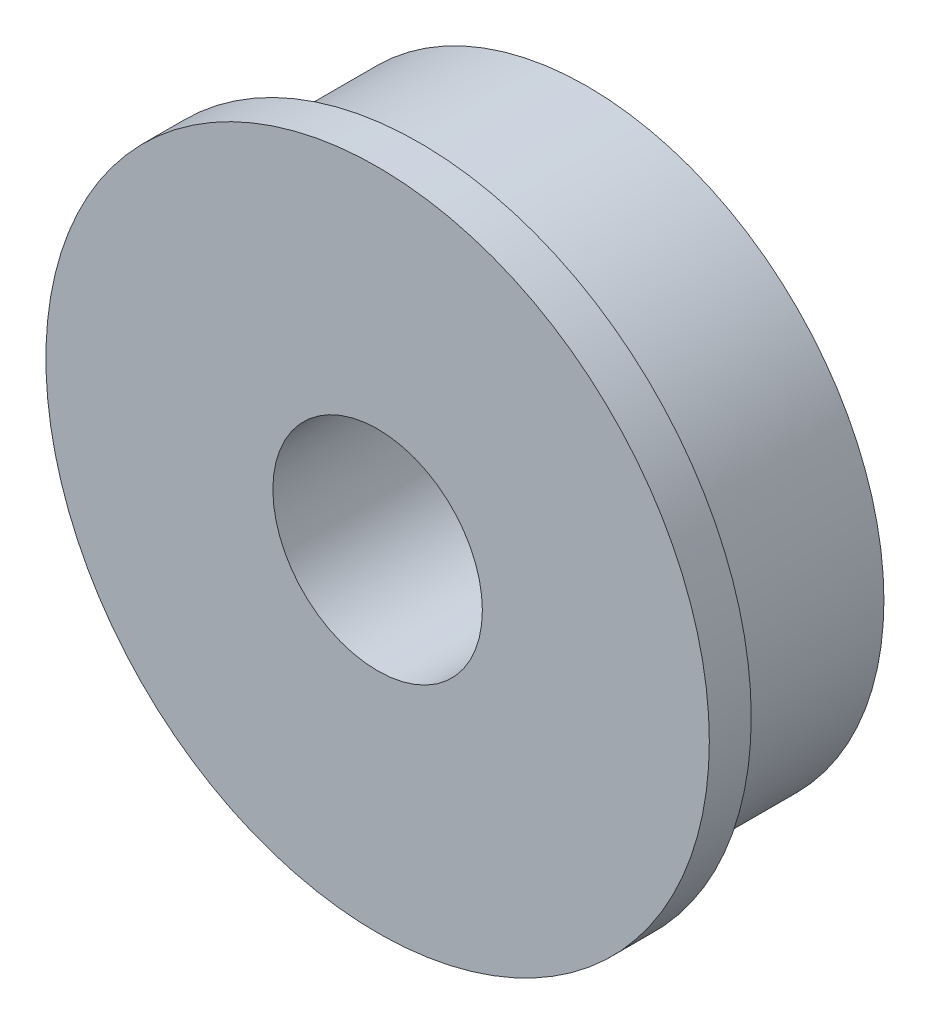
ISO-10303-21;
HEADER;
FILE_DESCRIPTION(('STEP AP214'),'2;1');
FILE_NAME('part.step','',(''),(''),'','','');
FILE_SCHEMA(('AUTOMOTIVE_DESIGN { 1 0 10303 214 1 1 1 1 }'));
ENDSEC;
DATA;
#1=APPLICATION_CONTEXT('core data for automotive mechanical design processes');
#2=APPLICATION_PROTOCOL_DEFINITION('international standard','automotive_design',2000,#1);
#3=PRODUCT_CONTEXT('',#1,'mechanical');
#4=PRODUCT('Part','Part','',(#3));
#5=PRODUCT_RELATED_PRODUCT_CATEGORY('part','',(#4));
#6=PRODUCT_DEFINITION_FORMATION('','',#4);
#7=PRODUCT_DEFINITION_CONTEXT('part definition',#1,'design');
#8=PRODUCT_DEFINITION('design','',#6,#7);
#9=PRODUCT_DEFINITION_SHAPE('','',#8);
#10=(LENGTH_UNIT() NAMED_UNIT(*) SI_UNIT(.MILLI.,.METRE.));
#11=(NAMED_UNIT(*) PLANE_ANGLE_UNIT() SI_UNIT($,.RADIAN.));
#12=(NAMED_UNIT(*) SI_UNIT($,.STERADIAN.) SOLID_ANGLE_UNIT());
#13=UNCERTAINTY_MEASURE_WITH_UNIT(LENGTH_MEASURE(1.E-05),#10,'distance_accuracy_value','');
#14=(GEOMETRIC_REPRESENTATION_CONTEXT(3) GLOBAL_UNCERTAINTY_ASSIGNED_CONTEXT((#13)) GLOBAL_UNIT_ASSIGNED_CONTEXT((#10,
#11,#12)) REPRESENTATION_CONTEXT('',''));
#15=CARTESIAN_POINT('',(0.,0.,0.));
#16=DIRECTION('',(0.,0.,1.));
#17=DIRECTION('',(1.,0.,0.));
#18=AXIS2_PLACEMENT_3D('',#15,#16,#17);
#19=CARTESIAN_POINT('',(0.,0.,6.));
#20=DIRECTION('',(0.,0.,-1.));
#21=DIRECTION('',(-1.,0.,0.));
#22=AXIS2_PLACEMENT_3D('',#19,#20,#21);
#23=CYLINDRICAL_SURFACE('',#22,8.5);
#24=CARTESIAN_POINT('',(0.,0.,0.));
#25=DIRECTION('',(0.,0.,1.));
#26=DIRECTION('',(1.,0.,0.));
#27=AXIS2_PLACEMENT_3D('',#24,#25,#26);
#28=CIRCLE('',#27,8.5);
#29=CARTESIAN_POINT('',(8.5,0.,0.));
#30=VERTEX_POINT('',#29);
#31=EDGE_CURVE('E43',#30,#30,#28,.T.);
#32=ORIENTED_EDGE('',*,*,#31,.T.);
#33=EDGE_LOOP('',(#32));
#34=FACE_BOUND('',#33,.T.);
#35=CARTESIAN_POINT('',(0.,0.,4.8));
#36=DIRECTION('',(0.,0.,1.));
#37=DIRECTION('',(1.,0.,0.));
#38=AXIS2_PLACEMENT_3D('',#35,#36,#37);
#39=CIRCLE('',#38,8.5);
#40=CARTESIAN_POINT('',(8.5,0.,4.8));
#41=VERTEX_POINT('',#40);
#42=EDGE_CURVE('E10',#41,#41,#39,.T.);
#43=ORIENTED_EDGE('',*,*,#42,.F.);
#44=EDGE_LOOP('',(#43));
#45=FACE_BOUND('',#44,.T.);
#46=ADVANCED_FACE('F37',(#34,#45),#23,.T.);
#47=CARTESIAN_POINT('',(0.,0.,6.));
#48=DIRECTION('',(0.,0.,1.));
#49=DIRECTION('',(1.,0.,0.));
#50=AXIS2_PLACEMENT_3D('',#47,#48,#49);
#51=PLANE('',#50);
#52=CARTESIAN_POINT('',(0.,0.,6.));
#53=DIRECTION('',(0.,0.,1.));
#54=DIRECTION('',(1.,0.,0.));
#55=AXIS2_PLACEMENT_3D('',#52,#53,#54);
#56=CIRCLE('',#55,3.);
#57=CARTESIAN_POINT('',(3.,0.,6.));
#58=VERTEX_POINT('',#57);
#59=EDGE_CURVE('E47',#58,#58,#56,.T.);
#60=ORIENTED_EDGE('',*,*,#59,.F.);
#61=EDGE_LOOP('',(#60));
#62=FACE_BOUND('',#61,.T.);
#63=CARTESIAN_POINT('',(0.,0.,6.));
#64=DIRECTION('',(0.,0.,1.));
#65=DIRECTION('',(1.,0.,0.));
#66=AXIS2_PLACEMENT_3D('',#63,#64,#65);
#67=CIRCLE('',#66,9.5);
#68=CARTESIAN_POINT('',(9.5,0.,6.));
#69=VERTEX_POINT('',#68);
#70=EDGE_CURVE('E57',#69,#69,#67,.T.);
#71=ORIENTED_EDGE('',*,*,#70,.T.);
#72=EDGE_LOOP('',(#71));
#73=FACE_BOUND('',#72,.T.);
#74=ADVANCED_FACE('F75',(#62,#73),#51,.T.);
#75=CARTESIAN_POINT('',(0.,0.,0.));
#76=DIRECTION('',(0.,0.,1.));
#77=DIRECTION('',(1.,0.,0.));
#78=AXIS2_PLACEMENT_3D('',#75,#76,#77);
#79=PLANE('',#78);
#80=ORIENTED_EDGE('',*,*,#31,.F.);
#81=EDGE_LOOP('',(#80));
#82=FACE_BOUND('',#81,.T.);
#83=CARTESIAN_POINT('',(0.,0.,0.));
#84=DIRECTION('',(0.,0.,1.));
#85=DIRECTION('',(1.,0.,0.));
#86=AXIS2_PLACEMENT_3D('',#83,#84,#85);
#87=CIRCLE('',#86,3.);
#88=CARTESIAN_POINT('',(3.,0.,0.));
#89=VERTEX_POINT('',#88);
#90=EDGE_CURVE('E51',#89,#89,#87,.T.);
#91=ORIENTED_EDGE('',*,*,#90,.T.);
#92=EDGE_LOOP('',(#91));
#93=FACE_BOUND('',#92,.T.);
#94=ADVANCED_FACE('F80',(#82,#93),#79,.F.);
#95=CARTESIAN_POINT('',(0.,0.,6.));
#96=DIRECTION('',(0.,0.,-1.));
#97=DIRECTION('',(-1.,0.,0.));
#98=AXIS2_PLACEMENT_3D('',#95,#96,#97);
#99=CYLINDRICAL_SURFACE('',#98,3.);
#100=ORIENTED_EDGE('',*,*,#59,.T.);
#101=EDGE_LOOP('',(#100));
#102=FACE_BOUND('',#101,.T.);
#103=ORIENTED_EDGE('',*,*,#90,.F.);
#104=EDGE_LOOP('',(#103));
#105=FACE_BOUND('',#104,.T.);
#106=ADVANCED_FACE('F72',(#102,#105),#99,.F.);
#107=CARTESIAN_POINT('',(0.,0.,4.8));
#108=DIRECTION('',(0.,0.,1.));
#109=DIRECTION('',(1.,0.,0.));
#110=AXIS2_PLACEMENT_3D('',#107,#108,#109);
#111=CYLINDRICAL_SURFACE('',#110,9.5);
#112=CARTESIAN_POINT('',(0.,0.,4.8));
#113=DIRECTION('',(0.,0.,1.));
#114=DIRECTION('',(1.,0.,0.));
#115=AXIS2_PLACEMENT_3D('',#112,#113,#114);
#116=CIRCLE('',#115,9.5);
#117=CARTESIAN_POINT('',(9.5,0.,4.8));
#118=VERTEX_POINT('',#117);
#119=EDGE_CURVE('E55',#118,#118,#116,.T.);
#120=ORIENTED_EDGE('',*,*,#119,.T.);
#121=EDGE_LOOP('',(#120));
#122=FACE_BOUND('',#121,.T.);
#123=ORIENTED_EDGE('',*,*,#70,.F.);
#124=EDGE_LOOP('',(#123));
#125=FACE_BOUND('',#124,.T.);
#126=ADVANCED_FACE('F63',(#122,#125),#111,.T.);
#127=CARTESIAN_POINT('',(0.,0.,4.8));
#128=DIRECTION('',(0.,0.,1.));
#129=DIRECTION('',(1.,0.,0.));
#130=AXIS2_PLACEMENT_3D('',#127,#128,#129);
#131=PLANE('',#130);
#132=ORIENTED_EDGE('',*,*,#42,.T.);
#133=EDGE_LOOP('',(#132));
#134=FACE_BOUND('',#133,.T.);
#135=ORIENTED_EDGE('',*,*,#119,.F.);
#136=EDGE_LOOP('',(#135));
#137=FACE_BOUND('',#136,.T.);
#138=ADVANCED_FACE('F66',(#134,#137),#131,.F.);
#139=CLOSED_SHELL('',(#46,#74,#94,#106,#126,#138));
#140=MANIFOLD_SOLID_BREP('B2',#139);
#141=ADVANCED_BREP_SHAPE_REPRESENTATION('',(#18,#140),#14);
#142=SHAPE_DEFINITION_REPRESENTATION(#9,#141);
ENDSEC;
END-ISO-10303-21;
